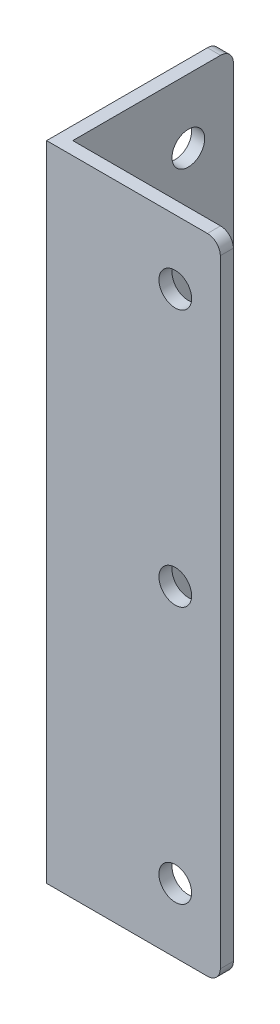
ISO-10303-21;
HEADER;
FILE_DESCRIPTION(('STEP AP214'),'2;1');
FILE_NAME('part.step','',(''),(''),'','','');
FILE_SCHEMA(('AUTOMOTIVE_DESIGN { 1 0 10303 214 1 1 1 1 }'));
ENDSEC;
DATA;
#1=APPLICATION_CONTEXT('core data for automotive mechanical design processes');
#2=APPLICATION_PROTOCOL_DEFINITION('international standard','automotive_design',2000,#1);
#3=PRODUCT_CONTEXT('',#1,'mechanical');
#4=PRODUCT('Part','Part','',(#3));
#5=PRODUCT_RELATED_PRODUCT_CATEGORY('part','',(#4));
#6=PRODUCT_DEFINITION_FORMATION('','',#4);
#7=PRODUCT_DEFINITION_CONTEXT('part definition',#1,'design');
#8=PRODUCT_DEFINITION('design','',#6,#7);
#9=PRODUCT_DEFINITION_SHAPE('','',#8);
#10=(LENGTH_UNIT() NAMED_UNIT(*) SI_UNIT(.MILLI.,.METRE.));
#11=(NAMED_UNIT(*) PLANE_ANGLE_UNIT() SI_UNIT($,.RADIAN.));
#12=(NAMED_UNIT(*) SI_UNIT($,.STERADIAN.) SOLID_ANGLE_UNIT());
#13=UNCERTAINTY_MEASURE_WITH_UNIT(LENGTH_MEASURE(1.E-05),#10,'distance_accuracy_value','');
#14=(GEOMETRIC_REPRESENTATION_CONTEXT(3) GLOBAL_UNCERTAINTY_ASSIGNED_CONTEXT((#13)) GLOBAL_UNIT_ASSIGNED_CONTEXT((#10,
#11,#12)) REPRESENTATION_CONTEXT('',''));
#15=CARTESIAN_POINT('',(0.,0.,0.));
#16=DIRECTION('',(0.,0.,1.));
#17=DIRECTION('',(1.,0.,0.));
#18=AXIS2_PLACEMENT_3D('',#15,#16,#17);
#19=CARTESIAN_POINT('',(0.,100.,0.));
#20=DIRECTION('',(1.,0.,0.));
#21=DIRECTION('',(0.,0.,-1.));
#22=AXIS2_PLACEMENT_3D('',#19,#20,#21);
#23=PLANE('',#22);
#24=CARTESIAN_POINT('',(0.,10.,-20.));
#25=DIRECTION('',(1.,0.,0.));
#26=DIRECTION('',(0.,0.,-1.));
#27=AXIS2_PLACEMENT_3D('',#24,#25,#26);
#28=CIRCLE('',#27,2.54);
#29=CARTESIAN_POINT('',(0.,10.,-22.54));
#30=VERTEX_POINT('',#29);
#31=EDGE_CURVE('E185',#30,#30,#28,.T.);
#32=ORIENTED_EDGE('',*,*,#31,.T.);
#33=EDGE_LOOP('',(#32));
#34=FACE_BOUND('',#33,.T.);
#35=CARTESIAN_POINT('',(0.,90.,-20.));
#36=DIRECTION('',(1.,0.,0.));
#37=DIRECTION('',(0.,0.,-1.));
#38=AXIS2_PLACEMENT_3D('',#35,#36,#37);
#39=CIRCLE('',#38,2.54);
#40=CARTESIAN_POINT('',(0.,90.,-22.54));
#41=VERTEX_POINT('',#40);
#42=EDGE_CURVE('E291',#41,#41,#39,.T.);
#43=ORIENTED_EDGE('',*,*,#42,.T.);
#44=EDGE_LOOP('',(#43));
#45=FACE_BOUND('',#44,.T.);
#46=CARTESIAN_POINT('',(0.,50.,-20.));
#47=DIRECTION('',(1.,0.,0.));
#48=DIRECTION('',(0.,0.,-1.));
#49=AXIS2_PLACEMENT_3D('',#46,#47,#48);
#50=CIRCLE('',#49,2.54);
#51=CARTESIAN_POINT('',(0.,50.,-22.54));
#52=VERTEX_POINT('',#51);
#53=EDGE_CURVE('E272',#52,#52,#50,.T.);
#54=ORIENTED_EDGE('',*,*,#53,.T.);
#55=EDGE_LOOP('',(#54));
#56=FACE_BOUND('',#55,.T.);
#57=DIRECTION('',(0.,-1.,0.));
#58=VECTOR('',#57,1.);
#59=CARTESIAN_POINT('',(0.,100.,-27.));
#60=LINE('',#59,#58);
#61=CARTESIAN_POINT('',(0.,98.,-27.));
#62=VERTEX_POINT('',#61);
#63=CARTESIAN_POINT('',(0.,2.,-27.));
#64=VERTEX_POINT('',#63);
#65=EDGE_CURVE('E255',#62,#64,#60,.T.);
#66=ORIENTED_EDGE('',*,*,#65,.T.);
#67=CARTESIAN_POINT('',(0.,2.,-25.));
#68=DIRECTION('',(1.,0.,0.));
#69=DIRECTION('',(0.,0.,-1.));
#70=AXIS2_PLACEMENT_3D('',#67,#68,#69);
#71=CIRCLE('',#70,2.);
#72=CARTESIAN_POINT('',(0.,0.,-25.));
#73=VERTEX_POINT('',#72);
#74=EDGE_CURVE('E194',#64,#73,#71,.F.);
#75=ORIENTED_EDGE('',*,*,#74,.T.);
#76=DIRECTION('',(0.,0.,1.));
#77=VECTOR('',#76,1.);
#78=CARTESIAN_POINT('',(0.,0.,0.));
#79=LINE('',#78,#77);
#80=CARTESIAN_POINT('',(0.,0.,0.));
#81=VERTEX_POINT('',#80);
#82=EDGE_CURVE('E167',#73,#81,#79,.T.);
#83=ORIENTED_EDGE('',*,*,#82,.T.);
#84=DIRECTION('',(0.,-1.,0.));
#85=VECTOR('',#84,1.);
#86=CARTESIAN_POINT('',(0.,100.,0.));
#87=LINE('',#86,#85);
#88=CARTESIAN_POINT('',(0.,100.,0.));
#89=VERTEX_POINT('',#88);
#90=EDGE_CURVE('E161',#89,#81,#87,.T.);
#91=ORIENTED_EDGE('',*,*,#90,.F.);
#92=DIRECTION('',(0.,0.,1.));
#93=VECTOR('',#92,1.);
#94=CARTESIAN_POINT('',(0.,100.,0.));
#95=LINE('',#94,#93);
#96=CARTESIAN_POINT('',(0.,100.,-25.));
#97=VERTEX_POINT('',#96);
#98=EDGE_CURVE('E148',#97,#89,#95,.T.);
#99=ORIENTED_EDGE('',*,*,#98,.F.);
#100=CARTESIAN_POINT('',(0.,98.,-25.));
#101=DIRECTION('',(1.,0.,0.));
#102=DIRECTION('',(0.,0.,-1.));
#103=AXIS2_PLACEMENT_3D('',#100,#101,#102);
#104=CIRCLE('',#103,2.);
#105=EDGE_CURVE('E191',#97,#62,#104,.F.);
#106=ORIENTED_EDGE('',*,*,#105,.T.);
#107=EDGE_LOOP('',(#66,#75,#83,#91,#99,#106));
#108=FACE_BOUND('',#107,.T.);
#109=ADVANCED_FACE('F47',(#34,#45,#56,#108),#23,.F.);
#110=CARTESIAN_POINT('',(0.,100.,0.));
#111=DIRECTION('',(0.,0.,-1.));
#112=DIRECTION('',(-1.,0.,0.));
#113=AXIS2_PLACEMENT_3D('',#110,#111,#112);
#114=PLANE('',#113);
#115=CARTESIAN_POINT('',(20.0000011733185,9.99999765336265,1.17331839643436E-06));
#116=DIRECTION('',(0.,-1.17331860530373E-07,0.999999999999993));
#117=DIRECTION('',(0.999999999999993,-1.17331860530372E-07,0.));
#118=AXIS2_PLACEMENT_3D('',#115,#116,#117);
#119=CIRCLE('',#118,2.54);
#120=CARTESIAN_POINT('',(22.5400011733185,9.99999735533973,1.17331837049067E-06));
#121=VERTEX_POINT('',#120);
#122=EDGE_CURVE('E302',#121,#121,#119,.T.);
#123=ORIENTED_EDGE('',*,*,#122,.F.);
#124=EDGE_LOOP('',(#123));
#125=FACE_BOUND('',#124,.T.);
#126=CARTESIAN_POINT('',(20.0000105598673,89.9999976533628,0.));
#127=DIRECTION('',(0.,0.,-1.));
#128=DIRECTION('',(-1.,0.,0.));
#129=AXIS2_PLACEMENT_3D('',#126,#127,#128);
#130=CIRCLE('',#129,2.54);
#131=CARTESIAN_POINT('',(17.4600105598673,89.9999976533628,0.));
#132=VERTEX_POINT('',#131);
#133=EDGE_CURVE('E182',#132,#132,#130,.F.);
#134=ORIENTED_EDGE('',*,*,#133,.F.);
#135=EDGE_LOOP('',(#134));
#136=FACE_BOUND('',#135,.T.);
#137=CARTESIAN_POINT('',(20.0000058665929,49.9999976533621,5.86659281744117E-06));
#138=DIRECTION('',(0.,-1.17331860530373E-07,0.999999999999993));
#139=DIRECTION('',(0.999999999999993,-1.17331860530372E-07,0.));
#140=AXIS2_PLACEMENT_3D('',#137,#138,#139);
#141=CIRCLE('',#140,2.54);
#142=CARTESIAN_POINT('',(22.5400058665929,49.9999973553392,5.86659279149748E-06));
#143=VERTEX_POINT('',#142);
#144=EDGE_CURVE('E186',#143,#143,#141,.T.);
#145=ORIENTED_EDGE('',*,*,#144,.F.);
#146=EDGE_LOOP('',(#145));
#147=FACE_BOUND('',#146,.T.);
#148=DIRECTION('',(1.,0.,0.));
#149=VECTOR('',#148,1.);
#150=CARTESIAN_POINT('',(0.,0.,0.));
#151=LINE('',#150,#149);
#152=CARTESIAN_POINT('',(25.,0.,0.));
#153=VERTEX_POINT('',#152);
#154=EDGE_CURVE('E228',#81,#153,#151,.T.);
#155=ORIENTED_EDGE('',*,*,#154,.T.);
#156=CARTESIAN_POINT('',(25.,2.,0.));
#157=DIRECTION('',(0.,0.,-1.));
#158=DIRECTION('',(-1.,0.,0.));
#159=AXIS2_PLACEMENT_3D('',#156,#157,#158);
#160=CIRCLE('',#159,2.);
#161=CARTESIAN_POINT('',(27.,2.,0.));
#162=VERTEX_POINT('',#161);
#163=EDGE_CURVE('E223',#153,#162,#160,.F.);
#164=ORIENTED_EDGE('',*,*,#163,.T.);
#165=DIRECTION('',(0.,-1.,0.));
#166=VECTOR('',#165,1.);
#167=CARTESIAN_POINT('',(27.,100.,0.));
#168=LINE('',#167,#166);
#169=CARTESIAN_POINT('',(27.,98.,0.));
#170=VERTEX_POINT('',#169);
#171=EDGE_CURVE('E171',#170,#162,#168,.T.);
#172=ORIENTED_EDGE('',*,*,#171,.F.);
#173=CARTESIAN_POINT('',(25.,98.,0.));
#174=DIRECTION('',(0.,0.,-1.));
#175=DIRECTION('',(-1.,0.,0.));
#176=AXIS2_PLACEMENT_3D('',#173,#174,#175);
#177=CIRCLE('',#176,2.);
#178=CARTESIAN_POINT('',(25.,100.,0.));
#179=VERTEX_POINT('',#178);
#180=EDGE_CURVE('E67',#170,#179,#177,.F.);
#181=ORIENTED_EDGE('',*,*,#180,.T.);
#182=DIRECTION('',(1.,0.,0.));
#183=VECTOR('',#182,1.);
#184=CARTESIAN_POINT('',(0.,100.,0.));
#185=LINE('',#184,#183);
#186=EDGE_CURVE('E150',#89,#179,#185,.T.);
#187=ORIENTED_EDGE('',*,*,#186,.F.);
#188=ORIENTED_EDGE('',*,*,#90,.T.);
#189=EDGE_LOOP('',(#155,#164,#172,#181,#187,#188));
#190=FACE_BOUND('',#189,.T.);
#191=ADVANCED_FACE('F160',(#125,#136,#147,#190),#114,.F.);
#192=CARTESIAN_POINT('',(27.,100.,0.));
#193=DIRECTION('',(-1.,0.,0.));
#194=DIRECTION('',(0.,0.,1.));
#195=AXIS2_PLACEMENT_3D('',#192,#193,#194);
#196=PLANE('',#195);
#197=ORIENTED_EDGE('',*,*,#171,.T.);
#198=DIRECTION('',(0.,0.,-1.));
#199=VECTOR('',#198,1.);
#200=CARTESIAN_POINT('',(27.,2.,-2.03200000000001));
#201=LINE('',#200,#199);
#202=CARTESIAN_POINT('',(27.,2.,-2.03200000000001));
#203=VERTEX_POINT('',#202);
#204=EDGE_CURVE('E212',#162,#203,#201,.T.);
#205=ORIENTED_EDGE('',*,*,#204,.T.);
#206=DIRECTION('',(0.,-1.,0.));
#207=VECTOR('',#206,1.);
#208=CARTESIAN_POINT('',(27.,100.,-2.03200000000001));
#209=LINE('',#208,#207);
#210=CARTESIAN_POINT('',(27.,98.,-2.03200000000001));
#211=VERTEX_POINT('',#210);
#212=EDGE_CURVE('E178',#211,#203,#209,.T.);
#213=ORIENTED_EDGE('',*,*,#212,.F.);
#214=DIRECTION('',(0.,0.,-1.));
#215=VECTOR('',#214,1.);
#216=CARTESIAN_POINT('',(27.,98.,0.));
#217=LINE('',#216,#215);
#218=EDGE_CURVE('E209',#211,#170,#217,.F.);
#219=ORIENTED_EDGE('',*,*,#218,.T.);
#220=EDGE_LOOP('',(#197,#205,#213,#219));
#221=FACE_BOUND('',#220,.T.);
#222=ADVANCED_FACE('F233',(#221),#196,.F.);
#223=CARTESIAN_POINT('',(2.032,100.,-2.032));
#224=DIRECTION('',(0.,0.,1.));
#225=DIRECTION('',(1.,0.,0.));
#226=AXIS2_PLACEMENT_3D('',#223,#224,#225);
#227=PLANE('',#226);
#228=CARTESIAN_POINT('',(20.0000105598673,89.9999978917811,-2.03200000000001));
#229=DIRECTION('',(0.,0.,1.));
#230=DIRECTION('',(1.,0.,0.));
#231=AXIS2_PLACEMENT_3D('',#228,#229,#230);
#232=CIRCLE('',#231,2.54);
#233=CARTESIAN_POINT('',(22.5400105598673,89.9999978917811,-2.03200000000001));
#234=VERTEX_POINT('',#233);
#235=EDGE_CURVE('E51',#234,#234,#232,.T.);
#236=ORIENTED_EDGE('',*,*,#235,.T.);
#237=EDGE_LOOP('',(#236));
#238=FACE_BOUND('',#237,.T.);
#239=CARTESIAN_POINT('',(20.0000011733185,9.99999789178099,-2.03199882668158));
#240=DIRECTION('',(0.,-1.17331860530373E-07,0.999999999999993));
#241=DIRECTION('',(0.999999999999993,-1.17331860530372E-07,0.));
#242=AXIS2_PLACEMENT_3D('',#239,#240,#241);
#243=CIRCLE('',#242,2.54);
#244=CARTESIAN_POINT('',(22.5400011733185,9.99999759375807,-2.03199882668161));
#245=VERTEX_POINT('',#244);
#246=EDGE_CURVE('E306',#245,#245,#243,.T.);
#247=ORIENTED_EDGE('',*,*,#246,.T.);
#248=EDGE_LOOP('',(#247));
#249=FACE_BOUND('',#248,.T.);
#250=CARTESIAN_POINT('',(20.0000058665929,49.9999978917804,-2.03199413340716));
#251=DIRECTION('',(0.,-1.17331860530373E-07,0.999999999999993));
#252=DIRECTION('',(0.999999999999993,-1.17331860530372E-07,0.));
#253=AXIS2_PLACEMENT_3D('',#250,#251,#252);
#254=CIRCLE('',#253,2.54);
#255=CARTESIAN_POINT('',(22.5400058665929,49.9999975937575,-2.03199413340719));
#256=VERTEX_POINT('',#255);
#257=EDGE_CURVE('E298',#256,#256,#254,.T.);
#258=ORIENTED_EDGE('',*,*,#257,.T.);
#259=EDGE_LOOP('',(#258));
#260=FACE_BOUND('',#259,.T.);
#261=ORIENTED_EDGE('',*,*,#212,.T.);
#262=CARTESIAN_POINT('',(25.,2.,-2.03200000000001));
#263=DIRECTION('',(0.,0.,1.));
#264=DIRECTION('',(1.,0.,0.));
#265=AXIS2_PLACEMENT_3D('',#262,#263,#264);
#266=CIRCLE('',#265,2.);
#267=CARTESIAN_POINT('',(25.,0.,-2.03200000000001));
#268=VERTEX_POINT('',#267);
#269=EDGE_CURVE('E218',#203,#268,#266,.F.);
#270=ORIENTED_EDGE('',*,*,#269,.T.);
#271=DIRECTION('',(-1.,0.,0.));
#272=VECTOR('',#271,1.);
#273=CARTESIAN_POINT('',(2.032,0.,-2.032));
#274=LINE('',#273,#272);
#275=CARTESIAN_POINT('',(2.032,0.,-2.032));
#276=VERTEX_POINT('',#275);
#277=EDGE_CURVE('E241',#268,#276,#274,.T.);
#278=ORIENTED_EDGE('',*,*,#277,.T.);
#279=DIRECTION('',(0.,-1.,0.));
#280=VECTOR('',#279,1.);
#281=CARTESIAN_POINT('',(2.032,100.,-2.032));
#282=LINE('',#281,#280);
#283=CARTESIAN_POINT('',(2.032,100.,-2.032));
#284=VERTEX_POINT('',#283);
#285=EDGE_CURVE('E263',#284,#276,#282,.T.);
#286=ORIENTED_EDGE('',*,*,#285,.F.);
#287=DIRECTION('',(-1.,0.,0.));
#288=VECTOR('',#287,1.);
#289=CARTESIAN_POINT('',(2.032,100.,-2.032));
#290=LINE('',#289,#288);
#291=CARTESIAN_POINT('',(25.,100.,-2.03200000000001));
#292=VERTEX_POINT('',#291);
#293=EDGE_CURVE('E163',#292,#284,#290,.T.);
#294=ORIENTED_EDGE('',*,*,#293,.F.);
#295=CARTESIAN_POINT('',(25.,98.,-2.03200000000001));
#296=DIRECTION('',(0.,0.,1.));
#297=DIRECTION('',(1.,0.,0.));
#298=AXIS2_PLACEMENT_3D('',#295,#296,#297);
#299=CIRCLE('',#298,2.);
#300=EDGE_CURVE('E76',#292,#211,#299,.F.);
#301=ORIENTED_EDGE('',*,*,#300,.T.);
#302=EDGE_LOOP('',(#261,#270,#278,#286,#294,#301));
#303=FACE_BOUND('',#302,.T.);
#304=ADVANCED_FACE('F239',(#238,#249,#260,#303),#227,.F.);
#305=CARTESIAN_POINT('',(2.032,100.,-2.032));
#306=DIRECTION('',(-1.,0.,0.));
#307=DIRECTION('',(0.,0.,1.));
#308=AXIS2_PLACEMENT_3D('',#305,#306,#307);
#309=PLANE('',#308);
#310=CARTESIAN_POINT('',(2.032,10.,-20.));
#311=DIRECTION('',(1.,0.,0.));
#312=DIRECTION('',(0.,0.,-1.));
#313=AXIS2_PLACEMENT_3D('',#310,#311,#312);
#314=CIRCLE('',#313,2.54);
#315=CARTESIAN_POINT('',(2.032,10.,-22.54));
#316=VERTEX_POINT('',#315);
#317=EDGE_CURVE('E287',#316,#316,#314,.T.);
#318=ORIENTED_EDGE('',*,*,#317,.F.);
#319=EDGE_LOOP('',(#318));
#320=FACE_BOUND('',#319,.T.);
#321=CARTESIAN_POINT('',(2.032,90.,-20.));
#322=DIRECTION('',(1.,0.,0.));
#323=DIRECTION('',(0.,0.,-1.));
#324=AXIS2_PLACEMENT_3D('',#321,#322,#323);
#325=CIRCLE('',#324,2.54);
#326=CARTESIAN_POINT('',(2.032,90.,-22.54));
#327=VERTEX_POINT('',#326);
#328=EDGE_CURVE('E281',#327,#327,#325,.T.);
#329=ORIENTED_EDGE('',*,*,#328,.F.);
#330=EDGE_LOOP('',(#329));
#331=FACE_BOUND('',#330,.T.);
#332=CARTESIAN_POINT('',(2.032,50.,-20.));
#333=DIRECTION('',(1.,0.,0.));
#334=DIRECTION('',(0.,0.,-1.));
#335=AXIS2_PLACEMENT_3D('',#332,#333,#334);
#336=CIRCLE('',#335,2.54);
#337=CARTESIAN_POINT('',(2.032,50.,-22.54));
#338=VERTEX_POINT('',#337);
#339=EDGE_CURVE('E275',#338,#338,#336,.T.);
#340=ORIENTED_EDGE('',*,*,#339,.F.);
#341=EDGE_LOOP('',(#340));
#342=FACE_BOUND('',#341,.T.);
#343=DIRECTION('',(0.,0.,-1.));
#344=VECTOR('',#343,1.);
#345=CARTESIAN_POINT('',(2.032,0.,-2.032));
#346=LINE('',#345,#344);
#347=CARTESIAN_POINT('',(2.032,0.,-25.));
#348=VERTEX_POINT('',#347);
#349=EDGE_CURVE('E156',#276,#348,#346,.T.);
#350=ORIENTED_EDGE('',*,*,#349,.T.);
#351=CARTESIAN_POINT('',(2.032,2.,-25.));
#352=DIRECTION('',(-1.,0.,0.));
#353=DIRECTION('',(0.,0.,1.));
#354=AXIS2_PLACEMENT_3D('',#351,#352,#353);
#355=CIRCLE('',#354,2.);
#356=CARTESIAN_POINT('',(2.032,2.,-27.));
#357=VERTEX_POINT('',#356);
#358=EDGE_CURVE('E206',#348,#357,#355,.F.);
#359=ORIENTED_EDGE('',*,*,#358,.T.);
#360=DIRECTION('',(0.,-1.,0.));
#361=VECTOR('',#360,1.);
#362=CARTESIAN_POINT('',(2.032,100.,-27.));
#363=LINE('',#362,#361);
#364=CARTESIAN_POINT('',(2.032,98.,-27.));
#365=VERTEX_POINT('',#364);
#366=EDGE_CURVE('E258',#365,#357,#363,.T.);
#367=ORIENTED_EDGE('',*,*,#366,.F.);
#368=CARTESIAN_POINT('',(2.032,98.,-25.));
#369=DIRECTION('',(-1.,0.,0.));
#370=DIRECTION('',(0.,0.,1.));
#371=AXIS2_PLACEMENT_3D('',#368,#369,#370);
#372=CIRCLE('',#371,2.);
#373=CARTESIAN_POINT('',(2.032,100.,-25.));
#374=VERTEX_POINT('',#373);
#375=EDGE_CURVE('E203',#365,#374,#372,.F.);
#376=ORIENTED_EDGE('',*,*,#375,.T.);
#377=DIRECTION('',(0.,0.,-1.));
#378=VECTOR('',#377,1.);
#379=CARTESIAN_POINT('',(2.032,100.,-2.032));
#380=LINE('',#379,#378);
#381=EDGE_CURVE('E259',#284,#374,#380,.T.);
#382=ORIENTED_EDGE('',*,*,#381,.F.);
#383=ORIENTED_EDGE('',*,*,#285,.T.);
#384=EDGE_LOOP('',(#350,#359,#367,#376,#382,#383));
#385=FACE_BOUND('',#384,.T.);
#386=ADVANCED_FACE('F332',(#320,#331,#342,#385),#309,.F.);
#387=CARTESIAN_POINT('',(0.,100.,-27.));
#388=DIRECTION('',(0.,0.,1.));
#389=DIRECTION('',(1.,0.,0.));
#390=AXIS2_PLACEMENT_3D('',#387,#388,#389);
#391=PLANE('',#390);
#392=ORIENTED_EDGE('',*,*,#366,.T.);
#393=DIRECTION('',(-1.,0.,0.));
#394=VECTOR('',#393,1.);
#395=CARTESIAN_POINT('',(0.,2.,-27.));
#396=LINE('',#395,#394);
#397=EDGE_CURVE('E175',#357,#64,#396,.T.);
#398=ORIENTED_EDGE('',*,*,#397,.T.);
#399=ORIENTED_EDGE('',*,*,#65,.F.);
#400=DIRECTION('',(-1.,0.,0.));
#401=VECTOR('',#400,1.);
#402=CARTESIAN_POINT('',(0.,98.,-27.));
#403=LINE('',#402,#401);
#404=EDGE_CURVE('E170',#62,#365,#403,.F.);
#405=ORIENTED_EDGE('',*,*,#404,.T.);
#406=EDGE_LOOP('',(#392,#398,#399,#405));
#407=FACE_BOUND('',#406,.T.);
#408=ADVANCED_FACE('F337',(#407),#391,.F.);
#409=CARTESIAN_POINT('',(0.,100.,0.));
#410=DIRECTION('',(0.,-1.,0.));
#411=DIRECTION('',(0.,0.,-1.));
#412=AXIS2_PLACEMENT_3D('',#409,#410,#411);
#413=PLANE('',#412);
#414=ORIENTED_EDGE('',*,*,#186,.T.);
#415=DIRECTION('',(0.,0.,-1.));
#416=VECTOR('',#415,1.);
#417=CARTESIAN_POINT('',(25.,100.,0.));
#418=LINE('',#417,#416);
#419=EDGE_CURVE('E11',#179,#292,#418,.T.);
#420=ORIENTED_EDGE('',*,*,#419,.T.);
#421=ORIENTED_EDGE('',*,*,#293,.T.);
#422=ORIENTED_EDGE('',*,*,#381,.T.);
#423=DIRECTION('',(-1.,0.,0.));
#424=VECTOR('',#423,1.);
#425=CARTESIAN_POINT('',(0.,100.,-25.));
#426=LINE('',#425,#424);
#427=EDGE_CURVE('E57',#374,#97,#426,.T.);
#428=ORIENTED_EDGE('',*,*,#427,.T.);
#429=ORIENTED_EDGE('',*,*,#98,.T.);
#430=EDGE_LOOP('',(#414,#420,#421,#422,#428,#429));
#431=FACE_BOUND('',#430,.T.);
#432=ADVANCED_FACE('F149',(#431),#413,.F.);
#433=CARTESIAN_POINT('',(0.,0.,0.));
#434=DIRECTION('',(0.,-1.,0.));
#435=DIRECTION('',(0.,0.,-1.));
#436=AXIS2_PLACEMENT_3D('',#433,#434,#435);
#437=PLANE('',#436);
#438=ORIENTED_EDGE('',*,*,#82,.F.);
#439=DIRECTION('',(-1.,0.,0.));
#440=VECTOR('',#439,1.);
#441=CARTESIAN_POINT('',(2.032,0.,-25.));
#442=LINE('',#441,#440);
#443=EDGE_CURVE('E200',#73,#348,#442,.F.);
#444=ORIENTED_EDGE('',*,*,#443,.T.);
#445=ORIENTED_EDGE('',*,*,#349,.F.);
#446=ORIENTED_EDGE('',*,*,#277,.F.);
#447=DIRECTION('',(0.,0.,-1.));
#448=VECTOR('',#447,1.);
#449=CARTESIAN_POINT('',(25.,0.,0.));
#450=LINE('',#449,#448);
#451=EDGE_CURVE('E197',#268,#153,#450,.F.);
#452=ORIENTED_EDGE('',*,*,#451,.T.);
#453=ORIENTED_EDGE('',*,*,#154,.F.);
#454=EDGE_LOOP('',(#438,#444,#445,#446,#452,#453));
#455=FACE_BOUND('',#454,.T.);
#456=ADVANCED_FACE('F245',(#455),#437,.T.);
#457=CARTESIAN_POINT('',(0.,50.,-20.));
#458=DIRECTION('',(1.,0.,0.));
#459=DIRECTION('',(0.,0.,-1.));
#460=AXIS2_PLACEMENT_3D('',#457,#458,#459);
#461=CYLINDRICAL_SURFACE('',#460,2.54);
#462=ORIENTED_EDGE('',*,*,#53,.F.);
#463=EDGE_LOOP('',(#462));
#464=FACE_BOUND('',#463,.T.);
#465=ORIENTED_EDGE('',*,*,#339,.T.);
#466=EDGE_LOOP('',(#465));
#467=FACE_BOUND('',#466,.T.);
#468=ADVANCED_FACE('F382',(#464,#467),#461,.F.);
#469=CARTESIAN_POINT('',(0.,90.,-20.));
#470=DIRECTION('',(1.,0.,0.));
#471=DIRECTION('',(0.,0.,-1.));
#472=AXIS2_PLACEMENT_3D('',#469,#470,#471);
#473=CYLINDRICAL_SURFACE('',#472,2.54);
#474=ORIENTED_EDGE('',*,*,#42,.F.);
#475=EDGE_LOOP('',(#474));
#476=FACE_BOUND('',#475,.T.);
#477=ORIENTED_EDGE('',*,*,#328,.T.);
#478=EDGE_LOOP('',(#477));
#479=FACE_BOUND('',#478,.T.);
#480=ADVANCED_FACE('F386',(#476,#479),#473,.F.);
#481=CARTESIAN_POINT('',(0.,10.,-20.));
#482=DIRECTION('',(1.,0.,0.));
#483=DIRECTION('',(0.,0.,-1.));
#484=AXIS2_PLACEMENT_3D('',#481,#482,#483);
#485=CYLINDRICAL_SURFACE('',#484,2.54);
#486=ORIENTED_EDGE('',*,*,#31,.F.);
#487=EDGE_LOOP('',(#486));
#488=FACE_BOUND('',#487,.T.);
#489=ORIENTED_EDGE('',*,*,#317,.T.);
#490=EDGE_LOOP('',(#489));
#491=FACE_BOUND('',#490,.T.);
#492=ADVANCED_FACE('F327',(#488,#491),#485,.F.);
#493=CARTESIAN_POINT('',(20.0000058665929,49.9999976533621,5.86659281744117E-06));
#494=DIRECTION('',(0.,1.17331860530373E-07,-0.999999999999993));
#495=DIRECTION('',(0.,0.999999999999993,1.17331860530373E-07));
#496=AXIS2_PLACEMENT_3D('',#493,#494,#495);
#497=CYLINDRICAL_SURFACE('',#496,2.54);
#498=ORIENTED_EDGE('',*,*,#144,.T.);
#499=EDGE_LOOP('',(#498));
#500=FACE_BOUND('',#499,.T.);
#501=ORIENTED_EDGE('',*,*,#257,.F.);
#502=EDGE_LOOP('',(#501));
#503=FACE_BOUND('',#502,.T.);
#504=ADVANCED_FACE('F324',(#500,#503),#497,.F.);
#505=CARTESIAN_POINT('',(20.0000011733185,9.99999765336265,1.17331839643436E-06));
#506=DIRECTION('',(0.,1.17331860530373E-07,-0.999999999999993));
#507=DIRECTION('',(0.,0.999999999999993,1.17331860530373E-07));
#508=AXIS2_PLACEMENT_3D('',#505,#506,#507);
#509=CYLINDRICAL_SURFACE('',#508,2.54);
#510=ORIENTED_EDGE('',*,*,#122,.T.);
#511=EDGE_LOOP('',(#510));
#512=FACE_BOUND('',#511,.T.);
#513=ORIENTED_EDGE('',*,*,#246,.F.);
#514=EDGE_LOOP('',(#513));
#515=FACE_BOUND('',#514,.T.);
#516=ADVANCED_FACE('F314',(#512,#515),#509,.F.);
#517=CARTESIAN_POINT('',(20.0000105598673,89.9999976533616,1.05598672388817E-05));
#518=DIRECTION('',(0.,1.17331860530373E-07,-0.999999999999993));
#519=DIRECTION('',(0.,0.999999999999993,1.17331860530373E-07));
#520=AXIS2_PLACEMENT_3D('',#517,#518,#519);
#521=CYLINDRICAL_SURFACE('',#520,2.54);
#522=ORIENTED_EDGE('',*,*,#133,.T.);
#523=EDGE_LOOP('',(#522));
#524=FACE_BOUND('',#523,.T.);
#525=ORIENTED_EDGE('',*,*,#235,.F.);
#526=EDGE_LOOP('',(#525));
#527=FACE_BOUND('',#526,.T.);
#528=ADVANCED_FACE('F354',(#524,#527),#521,.F.);
#529=CARTESIAN_POINT('',(0.,2.,-25.));
#530=DIRECTION('',(1.,0.,0.));
#531=DIRECTION('',(0.,0.,-1.));
#532=AXIS2_PLACEMENT_3D('',#529,#530,#531);
#533=CYLINDRICAL_SURFACE('',#532,2.);
#534=ORIENTED_EDGE('',*,*,#358,.F.);
#535=ORIENTED_EDGE('',*,*,#443,.F.);
#536=ORIENTED_EDGE('',*,*,#74,.F.);
#537=ORIENTED_EDGE('',*,*,#397,.F.);
#538=EDGE_LOOP('',(#534,#535,#536,#537));
#539=FACE_BOUND('',#538,.T.);
#540=ADVANCED_FACE('F351',(#539),#533,.T.);
#541=CARTESIAN_POINT('',(25.,2.,0.));
#542=DIRECTION('',(0.,0.,1.));
#543=DIRECTION('',(1.,0.,0.));
#544=AXIS2_PLACEMENT_3D('',#541,#542,#543);
#545=CYLINDRICAL_SURFACE('',#544,2.);
#546=ORIENTED_EDGE('',*,*,#163,.F.);
#547=ORIENTED_EDGE('',*,*,#451,.F.);
#548=ORIENTED_EDGE('',*,*,#269,.F.);
#549=ORIENTED_EDGE('',*,*,#204,.F.);
#550=EDGE_LOOP('',(#546,#547,#548,#549));
#551=FACE_BOUND('',#550,.T.);
#552=ADVANCED_FACE('F236',(#551),#545,.T.);
#553=CARTESIAN_POINT('',(25.,98.,0.));
#554=DIRECTION('',(0.,0.,-1.));
#555=DIRECTION('',(-1.,0.,0.));
#556=AXIS2_PLACEMENT_3D('',#553,#554,#555);
#557=CYLINDRICAL_SURFACE('',#556,2.);
#558=ORIENTED_EDGE('',*,*,#180,.F.);
#559=ORIENTED_EDGE('',*,*,#218,.F.);
#560=ORIENTED_EDGE('',*,*,#300,.F.);
#561=ORIENTED_EDGE('',*,*,#419,.F.);
#562=EDGE_LOOP('',(#558,#559,#560,#561));
#563=FACE_BOUND('',#562,.T.);
#564=ADVANCED_FACE('F357',(#563),#557,.T.);
#565=CARTESIAN_POINT('',(0.,98.,-25.));
#566=DIRECTION('',(-1.,0.,0.));
#567=DIRECTION('',(0.,0.,1.));
#568=AXIS2_PLACEMENT_3D('',#565,#566,#567);
#569=CYLINDRICAL_SURFACE('',#568,2.);
#570=ORIENTED_EDGE('',*,*,#375,.F.);
#571=ORIENTED_EDGE('',*,*,#404,.F.);
#572=ORIENTED_EDGE('',*,*,#105,.F.);
#573=ORIENTED_EDGE('',*,*,#427,.F.);
#574=EDGE_LOOP('',(#570,#571,#572,#573));
#575=FACE_BOUND('',#574,.T.);
#576=ADVANCED_FACE('F49',(#575),#569,.T.);
#577=CLOSED_SHELL('',(#109,#191,#222,#304,#386,#408,#432,#456,#468,#480,#492,#504,#516,#528,
#540,#552,#564,#576));
#578=MANIFOLD_SOLID_BREP('B2',#577);
#579=ADVANCED_BREP_SHAPE_REPRESENTATION('',(#18,#578),#14);
#580=SHAPE_DEFINITION_REPRESENTATION(#9,#579);
ENDSEC;
END-ISO-10303-21;
